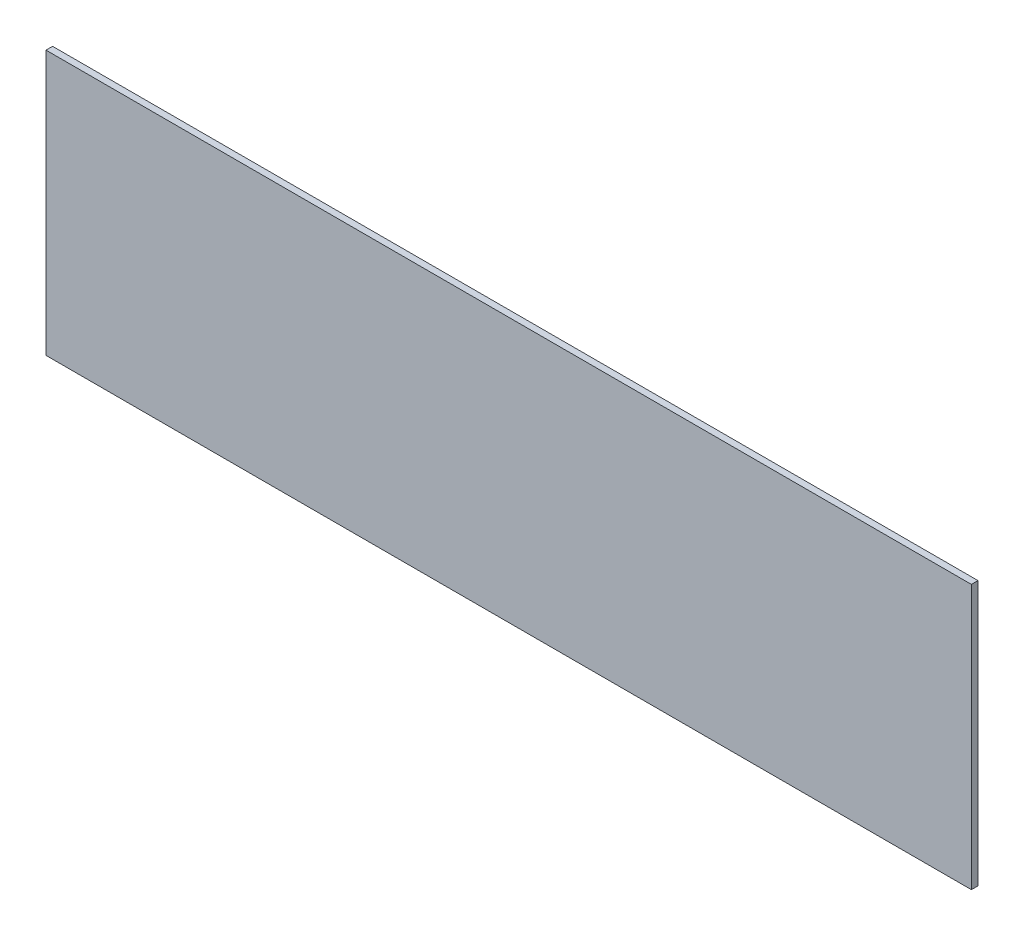
ISO-10303-21;
HEADER;
FILE_DESCRIPTION(('STEP AP214'),'2;1');
FILE_NAME('part.step','',(''),(''),'','','');
FILE_SCHEMA(('AUTOMOTIVE_DESIGN { 1 0 10303 214 1 1 1 1 }'));
ENDSEC;
DATA;
#1=APPLICATION_CONTEXT('core data for automotive mechanical design processes');
#2=APPLICATION_PROTOCOL_DEFINITION('international standard','automotive_design',2000,#1);
#3=PRODUCT_CONTEXT('',#1,'mechanical');
#4=PRODUCT('Part','Part','',(#3));
#5=PRODUCT_RELATED_PRODUCT_CATEGORY('part','',(#4));
#6=PRODUCT_DEFINITION_FORMATION('','',#4);
#7=PRODUCT_DEFINITION_CONTEXT('part definition',#1,'design');
#8=PRODUCT_DEFINITION('design','',#6,#7);
#9=PRODUCT_DEFINITION_SHAPE('','',#8);
#10=(LENGTH_UNIT() NAMED_UNIT(*) SI_UNIT(.MILLI.,.METRE.));
#11=(NAMED_UNIT(*) PLANE_ANGLE_UNIT() SI_UNIT($,.RADIAN.));
#12=(NAMED_UNIT(*) SI_UNIT($,.STERADIAN.) SOLID_ANGLE_UNIT());
#13=UNCERTAINTY_MEASURE_WITH_UNIT(LENGTH_MEASURE(1.E-05),#10,'distance_accuracy_value','');
#14=(GEOMETRIC_REPRESENTATION_CONTEXT(3) GLOBAL_UNCERTAINTY_ASSIGNED_CONTEXT((#13)) GLOBAL_UNIT_ASSIGNED_CONTEXT((#10,
#11,#12)) REPRESENTATION_CONTEXT('',''));
#15=CARTESIAN_POINT('',(0.,0.,0.));
#16=DIRECTION('',(0.,0.,1.));
#17=DIRECTION('',(1.,0.,0.));
#18=AXIS2_PLACEMENT_3D('',#15,#16,#17);
#19=CARTESIAN_POINT('',(700.,100.,10.));
#20=DIRECTION('',(-1.,0.,0.));
#21=DIRECTION('',(0.,0.,1.));
#22=AXIS2_PLACEMENT_3D('',#19,#20,#21);
#23=PLANE('',#22);
#24=DIRECTION('',(0.,1.,0.));
#25=VECTOR('',#24,1.);
#26=CARTESIAN_POINT('',(700.,100.,0.));
#27=LINE('',#26,#25);
#28=CARTESIAN_POINT('',(700.,-300.,0.));
#29=VERTEX_POINT('',#28);
#30=CARTESIAN_POINT('',(700.,100.,0.));
#31=VERTEX_POINT('',#30);
#32=EDGE_CURVE('E98',#29,#31,#27,.T.);
#33=ORIENTED_EDGE('',*,*,#32,.T.);
#34=DIRECTION('',(0.,0.,-1.));
#35=VECTOR('',#34,1.);
#36=CARTESIAN_POINT('',(700.,100.,10.));
#37=LINE('',#36,#35);
#38=CARTESIAN_POINT('',(700.,100.,10.));
#39=VERTEX_POINT('',#38);
#40=EDGE_CURVE('E11',#39,#31,#37,.T.);
#41=ORIENTED_EDGE('',*,*,#40,.F.);
#42=DIRECTION('',(0.,1.,0.));
#43=VECTOR('',#42,1.);
#44=CARTESIAN_POINT('',(700.,100.,10.));
#45=LINE('',#44,#43);
#46=CARTESIAN_POINT('',(700.,-300.,10.));
#47=VERTEX_POINT('',#46);
#48=EDGE_CURVE('E86',#47,#39,#45,.T.);
#49=ORIENTED_EDGE('',*,*,#48,.F.);
#50=DIRECTION('',(0.,0.,-1.));
#51=VECTOR('',#50,1.);
#52=CARTESIAN_POINT('',(700.,-300.,10.));
#53=LINE('',#52,#51);
#54=EDGE_CURVE('E94',#47,#29,#53,.T.);
#55=ORIENTED_EDGE('',*,*,#54,.T.);
#56=EDGE_LOOP('',(#33,#41,#49,#55));
#57=FACE_BOUND('',#56,.T.);
#58=ADVANCED_FACE('F35',(#57),#23,.F.);
#59=CARTESIAN_POINT('',(-700.,100.,10.));
#60=DIRECTION('',(0.,-1.,0.));
#61=DIRECTION('',(0.,0.,-1.));
#62=AXIS2_PLACEMENT_3D('',#59,#60,#61);
#63=PLANE('',#62);
#64=DIRECTION('',(-1.,0.,0.));
#65=VECTOR('',#64,1.);
#66=CARTESIAN_POINT('',(-700.,100.,0.));
#67=LINE('',#66,#65);
#68=CARTESIAN_POINT('',(-700.,100.,0.));
#69=VERTEX_POINT('',#68);
#70=EDGE_CURVE('E90',#31,#69,#67,.T.);
#71=ORIENTED_EDGE('',*,*,#70,.T.);
#72=DIRECTION('',(0.,0.,-1.));
#73=VECTOR('',#72,1.);
#74=CARTESIAN_POINT('',(-700.,100.,10.));
#75=LINE('',#74,#73);
#76=CARTESIAN_POINT('',(-700.,100.,10.));
#77=VERTEX_POINT('',#76);
#78=EDGE_CURVE('E43',#77,#69,#75,.T.);
#79=ORIENTED_EDGE('',*,*,#78,.F.);
#80=DIRECTION('',(-1.,0.,0.));
#81=VECTOR('',#80,1.);
#82=CARTESIAN_POINT('',(-700.,100.,10.));
#83=LINE('',#82,#81);
#84=EDGE_CURVE('E81',#39,#77,#83,.T.);
#85=ORIENTED_EDGE('',*,*,#84,.F.);
#86=ORIENTED_EDGE('',*,*,#40,.T.);
#87=EDGE_LOOP('',(#71,#79,#85,#86));
#88=FACE_BOUND('',#87,.T.);
#89=ADVANCED_FACE('F89',(#88),#63,.F.);
#90=CARTESIAN_POINT('',(-700.,100.,10.));
#91=DIRECTION('',(1.,0.,0.));
#92=DIRECTION('',(0.,0.,-1.));
#93=AXIS2_PLACEMENT_3D('',#90,#91,#92);
#94=PLANE('',#93);
#95=DIRECTION('',(0.,-1.,0.));
#96=VECTOR('',#95,1.);
#97=CARTESIAN_POINT('',(-700.,100.,0.));
#98=LINE('',#97,#96);
#99=CARTESIAN_POINT('',(-700.,-300.,0.));
#100=VERTEX_POINT('',#99);
#101=EDGE_CURVE('E68',#69,#100,#98,.T.);
#102=ORIENTED_EDGE('',*,*,#101,.T.);
#103=DIRECTION('',(0.,0.,-1.));
#104=VECTOR('',#103,1.);
#105=CARTESIAN_POINT('',(-700.,-300.,10.));
#106=LINE('',#105,#104);
#107=CARTESIAN_POINT('',(-700.,-300.,10.));
#108=VERTEX_POINT('',#107);
#109=EDGE_CURVE('E91',#108,#100,#106,.T.);
#110=ORIENTED_EDGE('',*,*,#109,.F.);
#111=DIRECTION('',(0.,-1.,0.));
#112=VECTOR('',#111,1.);
#113=CARTESIAN_POINT('',(-700.,100.,10.));
#114=LINE('',#113,#112);
#115=EDGE_CURVE('E84',#77,#108,#114,.T.);
#116=ORIENTED_EDGE('',*,*,#115,.F.);
#117=ORIENTED_EDGE('',*,*,#78,.T.);
#118=EDGE_LOOP('',(#102,#110,#116,#117));
#119=FACE_BOUND('',#118,.T.);
#120=ADVANCED_FACE('F92',(#119),#94,.F.);
#121=CARTESIAN_POINT('',(-700.,-300.,10.));
#122=DIRECTION('',(0.,1.,0.));
#123=DIRECTION('',(0.,0.,1.));
#124=AXIS2_PLACEMENT_3D('',#121,#122,#123);
#125=PLANE('',#124);
#126=DIRECTION('',(1.,0.,0.));
#127=VECTOR('',#126,1.);
#128=CARTESIAN_POINT('',(-700.,-300.,0.));
#129=LINE('',#128,#127);
#130=EDGE_CURVE('E74',#100,#29,#129,.T.);
#131=ORIENTED_EDGE('',*,*,#130,.T.);
#132=ORIENTED_EDGE('',*,*,#54,.F.);
#133=DIRECTION('',(1.,0.,0.));
#134=VECTOR('',#133,1.);
#135=CARTESIAN_POINT('',(-700.,-300.,10.));
#136=LINE('',#135,#134);
#137=EDGE_CURVE('E51',#108,#47,#136,.T.);
#138=ORIENTED_EDGE('',*,*,#137,.F.);
#139=ORIENTED_EDGE('',*,*,#109,.T.);
#140=EDGE_LOOP('',(#131,#132,#138,#139));
#141=FACE_BOUND('',#140,.T.);
#142=ADVANCED_FACE('F105',(#141),#125,.F.);
#143=CARTESIAN_POINT('',(0.,0.,10.));
#144=DIRECTION('',(0.,0.,1.));
#145=DIRECTION('',(1.,0.,0.));
#146=AXIS2_PLACEMENT_3D('',#143,#144,#145);
#147=PLANE('',#146);
#148=ORIENTED_EDGE('',*,*,#48,.T.);
#149=ORIENTED_EDGE('',*,*,#84,.T.);
#150=ORIENTED_EDGE('',*,*,#115,.T.);
#151=ORIENTED_EDGE('',*,*,#137,.T.);
#152=EDGE_LOOP('',(#148,#149,#150,#151));
#153=FACE_BOUND('',#152,.T.);
#154=ADVANCED_FACE('F82',(#153),#147,.T.);
#155=CARTESIAN_POINT('',(0.,0.,0.));
#156=DIRECTION('',(0.,0.,1.));
#157=DIRECTION('',(1.,0.,0.));
#158=AXIS2_PLACEMENT_3D('',#155,#156,#157);
#159=PLANE('',#158);
#160=ORIENTED_EDGE('',*,*,#32,.F.);
#161=ORIENTED_EDGE('',*,*,#130,.F.);
#162=ORIENTED_EDGE('',*,*,#101,.F.);
#163=ORIENTED_EDGE('',*,*,#70,.F.);
#164=EDGE_LOOP('',(#160,#161,#162,#163));
#165=FACE_BOUND('',#164,.T.);
#166=ADVANCED_FACE('F108',(#165),#159,.F.);
#167=CLOSED_SHELL('',(#58,#89,#120,#142,#154,#166));
#168=MANIFOLD_SOLID_BREP('B2',#167);
#169=ADVANCED_BREP_SHAPE_REPRESENTATION('',(#18,#168),#14);
#170=SHAPE_DEFINITION_REPRESENTATION(#9,#169);
ENDSEC;
END-ISO-10303-21;
